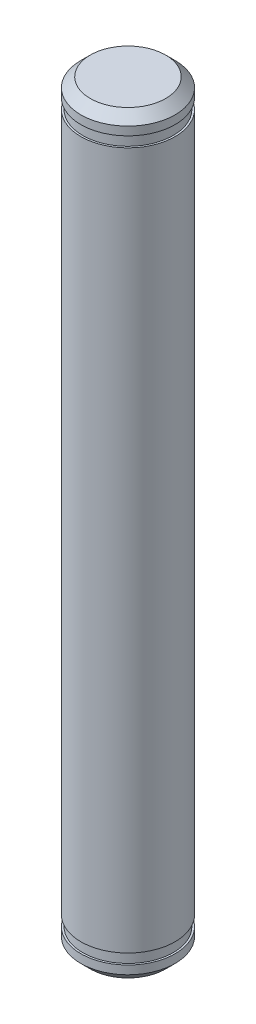
ISO-10303-21;
HEADER;
FILE_DESCRIPTION(('STEP AP214'),'2;1');
FILE_NAME('part.step','',(''),(''),'','','');
FILE_SCHEMA(('AUTOMOTIVE_DESIGN { 1 0 10303 214 1 1 1 1 }'));
ENDSEC;
DATA;
#1=APPLICATION_CONTEXT('core data for automotive mechanical design processes');
#2=APPLICATION_PROTOCOL_DEFINITION('international standard','automotive_design',2000,#1);
#3=PRODUCT_CONTEXT('',#1,'mechanical');
#4=PRODUCT('Part','Part','',(#3));
#5=PRODUCT_RELATED_PRODUCT_CATEGORY('part','',(#4));
#6=PRODUCT_DEFINITION_FORMATION('','',#4);
#7=PRODUCT_DEFINITION_CONTEXT('part definition',#1,'design');
#8=PRODUCT_DEFINITION('design','',#6,#7);
#9=PRODUCT_DEFINITION_SHAPE('','',#8);
#10=(LENGTH_UNIT() NAMED_UNIT(*) SI_UNIT(.MILLI.,.METRE.));
#11=(NAMED_UNIT(*) PLANE_ANGLE_UNIT() SI_UNIT($,.RADIAN.));
#12=(NAMED_UNIT(*) SI_UNIT($,.STERADIAN.) SOLID_ANGLE_UNIT());
#13=UNCERTAINTY_MEASURE_WITH_UNIT(LENGTH_MEASURE(1.E-05),#10,'distance_accuracy_value','');
#14=(GEOMETRIC_REPRESENTATION_CONTEXT(3) GLOBAL_UNCERTAINTY_ASSIGNED_CONTEXT((#13)) GLOBAL_UNIT_ASSIGNED_CONTEXT((#10,
#11,#12)) REPRESENTATION_CONTEXT('',''));
#15=CARTESIAN_POINT('',(0.,0.,0.));
#16=DIRECTION('',(0.,0.,1.));
#17=DIRECTION('',(1.,0.,0.));
#18=AXIS2_PLACEMENT_3D('',#15,#16,#17);
#19=CARTESIAN_POINT('',(0.,40.,0.));
#20=DIRECTION('',(0.,1.,0.));
#21=DIRECTION('',(-1.,0.,0.));
#22=AXIS2_PLACEMENT_3D('',#19,#20,#21);
#23=CYLINDRICAL_SURFACE('',#22,5.);
#24=CARTESIAN_POINT('',(0.,37.,0.));
#25=DIRECTION('',(0.,1.,0.));
#26=DIRECTION('',(-1.,0.,0.));
#27=AXIS2_PLACEMENT_3D('',#24,#25,#26);
#28=CIRCLE('',#27,5.);
#29=CARTESIAN_POINT('',(-5.00000000000002,37.,0.));
#30=VERTEX_POINT('',#29);
#31=EDGE_CURVE('E57',#30,#30,#28,.T.);
#32=ORIENTED_EDGE('',*,*,#31,.F.);
#33=EDGE_LOOP('',(#32));
#34=FACE_BOUND('',#33,.T.);
#35=CARTESIAN_POINT('',(0.,-37.,0.));
#36=DIRECTION('',(0.,1.,0.));
#37=DIRECTION('',(-1.,0.,0.));
#38=AXIS2_PLACEMENT_3D('',#35,#36,#37);
#39=CIRCLE('',#38,5.);
#40=CARTESIAN_POINT('',(-5.,-37.,0.));
#41=VERTEX_POINT('',#40);
#42=EDGE_CURVE('E69',#41,#41,#39,.T.);
#43=ORIENTED_EDGE('',*,*,#42,.T.);
#44=EDGE_LOOP('',(#43));
#45=FACE_BOUND('',#44,.T.);
#46=ADVANCED_FACE('F35',(#34,#45),#23,.T.);
#47=CARTESIAN_POINT('',(0.,40.,0.));
#48=DIRECTION('',(0.,-1.,0.));
#49=DIRECTION('',(1.,0.,0.));
#50=AXIS2_PLACEMENT_3D('',#47,#48,#49);
#51=PLANE('',#50);
#52=CARTESIAN_POINT('',(0.,40.,0.));
#53=DIRECTION('',(0.,-1.,0.));
#54=DIRECTION('',(1.,0.,0.));
#55=AXIS2_PLACEMENT_3D('',#52,#53,#54);
#56=CIRCLE('',#55,4.00000000000002);
#57=CARTESIAN_POINT('',(4.,40.,0.));
#58=VERTEX_POINT('',#57);
#59=EDGE_CURVE('E10',#58,#58,#56,.F.);
#60=ORIENTED_EDGE('',*,*,#59,.T.);
#61=EDGE_LOOP('',(#60));
#62=FACE_BOUND('',#61,.T.);
#63=ADVANCED_FACE('F110',(#62),#51,.F.);
#64=CARTESIAN_POINT('',(0.,38.1,0.));
#65=DIRECTION('',(0.,1.,0.));
#66=DIRECTION('',(-1.,0.,0.));
#67=AXIS2_PLACEMENT_3D('',#64,#65,#66);
#68=CIRCLE('',#67,5.);
#69=CARTESIAN_POINT('',(-5.00000000000002,38.1,0.));
#70=VERTEX_POINT('',#69);
#71=EDGE_CURVE('E56',#70,#70,#68,.T.);
#72=ORIENTED_EDGE('',*,*,#71,.T.);
#73=EDGE_LOOP('',(#72));
#74=FACE_BOUND('',#73,.T.);
#75=CARTESIAN_POINT('',(0.,39.,0.));
#76=DIRECTION('',(0.,-1.,0.));
#77=DIRECTION('',(1.,0.,0.));
#78=AXIS2_PLACEMENT_3D('',#75,#76,#77);
#79=CIRCLE('',#78,5.);
#80=CARTESIAN_POINT('',(4.99999999999999,39.,0.));
#81=VERTEX_POINT('',#80);
#82=EDGE_CURVE('E51',#81,#81,#79,.T.);
#83=ORIENTED_EDGE('',*,*,#82,.T.);
#84=EDGE_LOOP('',(#83));
#85=FACE_BOUND('',#84,.T.);
#86=ADVANCED_FACE('F97',(#74,#85),#23,.T.);
#87=CARTESIAN_POINT('',(0.,40.,0.));
#88=DIRECTION('',(0.,-1.,0.));
#89=DIRECTION('',(1.,0.,0.));
#90=AXIS2_PLACEMENT_3D('',#87,#88,#89);
#91=CONICAL_SURFACE('',#90,4.00000000000002,0.785398163397446);
#92=ORIENTED_EDGE('',*,*,#82,.F.);
#93=EDGE_LOOP('',(#92));
#94=FACE_BOUND('',#93,.T.);
#95=ORIENTED_EDGE('',*,*,#59,.F.);
#96=EDGE_LOOP('',(#95));
#97=FACE_BOUND('',#96,.T.);
#98=ADVANCED_FACE('F38',(#94,#97),#91,.T.);
#99=CARTESIAN_POINT('',(0.,38.1,0.));
#100=DIRECTION('',(0.,1.,0.));
#101=DIRECTION('',(-1.,0.,0.));
#102=AXIS2_PLACEMENT_3D('',#99,#100,#101);
#103=PLANE('',#102);
#104=ORIENTED_EDGE('',*,*,#71,.F.);
#105=EDGE_LOOP('',(#104));
#106=FACE_BOUND('',#105,.T.);
#107=CARTESIAN_POINT('',(0.,38.1,0.));
#108=DIRECTION('',(0.,1.,0.));
#109=DIRECTION('',(-1.,0.,0.));
#110=AXIS2_PLACEMENT_3D('',#107,#108,#109);
#111=CIRCLE('',#110,4.8);
#112=CARTESIAN_POINT('',(-4.80000000000001,38.1,0.));
#113=VERTEX_POINT('',#112);
#114=EDGE_CURVE('E60',#113,#113,#111,.T.);
#115=ORIENTED_EDGE('',*,*,#114,.T.);
#116=EDGE_LOOP('',(#115));
#117=FACE_BOUND('',#116,.T.);
#118=ADVANCED_FACE('F122',(#106,#117),#103,.F.);
#119=CARTESIAN_POINT('',(0.,37.,0.));
#120=DIRECTION('',(0.,1.,0.));
#121=DIRECTION('',(-1.,0.,0.));
#122=AXIS2_PLACEMENT_3D('',#119,#120,#121);
#123=PLANE('',#122);
#124=ORIENTED_EDGE('',*,*,#31,.T.);
#125=EDGE_LOOP('',(#124));
#126=FACE_BOUND('',#125,.T.);
#127=CARTESIAN_POINT('',(0.,37.,0.));
#128=DIRECTION('',(0.,1.,0.));
#129=DIRECTION('',(-1.,0.,0.));
#130=AXIS2_PLACEMENT_3D('',#127,#128,#129);
#131=CIRCLE('',#130,4.8);
#132=CARTESIAN_POINT('',(-4.80000000000001,37.,0.));
#133=VERTEX_POINT('',#132);
#134=EDGE_CURVE('E63',#133,#133,#131,.T.);
#135=ORIENTED_EDGE('',*,*,#134,.F.);
#136=EDGE_LOOP('',(#135));
#137=FACE_BOUND('',#136,.T.);
#138=ADVANCED_FACE('F131',(#126,#137),#123,.T.);
#139=CARTESIAN_POINT('',(0.,38.1,0.));
#140=DIRECTION('',(0.,-1.,0.));
#141=DIRECTION('',(1.,0.,0.));
#142=AXIS2_PLACEMENT_3D('',#139,#140,#141);
#143=CYLINDRICAL_SURFACE('',#142,4.8);
#144=ORIENTED_EDGE('',*,*,#114,.F.);
#145=EDGE_LOOP('',(#144));
#146=FACE_BOUND('',#145,.T.);
#147=ORIENTED_EDGE('',*,*,#134,.T.);
#148=EDGE_LOOP('',(#147));
#149=FACE_BOUND('',#148,.T.);
#150=ADVANCED_FACE('F88',(#146,#149),#143,.T.);
#151=CARTESIAN_POINT('',(0.,-38.1,0.));
#152=DIRECTION('',(0.,-1.,0.));
#153=DIRECTION('',(-1.,0.,0.));
#154=AXIS2_PLACEMENT_3D('',#151,#152,#153);
#155=PLANE('',#154);
#156=CARTESIAN_POINT('',(0.,-38.1,0.));
#157=DIRECTION('',(0.,1.,0.));
#158=DIRECTION('',(-1.,0.,0.));
#159=AXIS2_PLACEMENT_3D('',#156,#157,#158);
#160=CIRCLE('',#159,4.8);
#161=CARTESIAN_POINT('',(-4.79999999999999,-38.1,0.));
#162=VERTEX_POINT('',#161);
#163=EDGE_CURVE('E72',#162,#162,#160,.T.);
#164=ORIENTED_EDGE('',*,*,#163,.F.);
#165=EDGE_LOOP('',(#164));
#166=FACE_BOUND('',#165,.T.);
#167=CARTESIAN_POINT('',(0.,-38.1,0.));
#168=DIRECTION('',(0.,1.,0.));
#169=DIRECTION('',(-1.,0.,0.));
#170=AXIS2_PLACEMENT_3D('',#167,#168,#169);
#171=CIRCLE('',#170,5.);
#172=CARTESIAN_POINT('',(-5.,-38.1,0.));
#173=VERTEX_POINT('',#172);
#174=EDGE_CURVE('E66',#173,#173,#171,.T.);
#175=ORIENTED_EDGE('',*,*,#174,.T.);
#176=EDGE_LOOP('',(#175));
#177=FACE_BOUND('',#176,.T.);
#178=ADVANCED_FACE('F84',(#166,#177),#155,.F.);
#179=CARTESIAN_POINT('',(0.,-37.,0.));
#180=DIRECTION('',(0.,-1.,0.));
#181=DIRECTION('',(-1.,0.,0.));
#182=AXIS2_PLACEMENT_3D('',#179,#180,#181);
#183=PLANE('',#182);
#184=CARTESIAN_POINT('',(0.,-37.,0.));
#185=DIRECTION('',(0.,1.,0.));
#186=DIRECTION('',(-1.,0.,0.));
#187=AXIS2_PLACEMENT_3D('',#184,#185,#186);
#188=CIRCLE('',#187,4.8);
#189=CARTESIAN_POINT('',(-4.79999999999999,-37.,0.));
#190=VERTEX_POINT('',#189);
#191=EDGE_CURVE('E75',#190,#190,#188,.T.);
#192=ORIENTED_EDGE('',*,*,#191,.T.);
#193=EDGE_LOOP('',(#192));
#194=FACE_BOUND('',#193,.T.);
#195=ORIENTED_EDGE('',*,*,#42,.F.);
#196=EDGE_LOOP('',(#195));
#197=FACE_BOUND('',#196,.T.);
#198=ADVANCED_FACE('F87',(#194,#197),#183,.T.);
#199=CARTESIAN_POINT('',(0.,-38.1,0.));
#200=DIRECTION('',(0.,1.,0.));
#201=DIRECTION('',(-1.,0.,0.));
#202=AXIS2_PLACEMENT_3D('',#199,#200,#201);
#203=CYLINDRICAL_SURFACE('',#202,4.8);
#204=ORIENTED_EDGE('',*,*,#163,.T.);
#205=EDGE_LOOP('',(#204));
#206=FACE_BOUND('',#205,.T.);
#207=ORIENTED_EDGE('',*,*,#191,.F.);
#208=EDGE_LOOP('',(#207));
#209=FACE_BOUND('',#208,.T.);
#210=ADVANCED_FACE('F81',(#206,#209),#203,.T.);
#211=CARTESIAN_POINT('',(5.00000000000001,-40.,0.));
#212=DIRECTION('',(0.,1.,0.));
#213=DIRECTION('',(-1.,0.,0.));
#214=AXIS2_PLACEMENT_3D('',#211,#212,#213);
#215=PLANE('',#214);
#216=CARTESIAN_POINT('',(0.,-40.,0.));
#217=DIRECTION('',(0.,1.,0.));
#218=DIRECTION('',(-1.,0.,0.));
#219=AXIS2_PLACEMENT_3D('',#216,#217,#218);
#220=CIRCLE('',#219,3.99999999999998);
#221=CARTESIAN_POINT('',(-3.99999999999997,-40.,0.));
#222=VERTEX_POINT('',#221);
#223=EDGE_CURVE('E43',#222,#222,#220,.F.);
#224=ORIENTED_EDGE('',*,*,#223,.T.);
#225=EDGE_LOOP('',(#224));
#226=FACE_BOUND('',#225,.T.);
#227=ADVANCED_FACE('F101',(#226),#215,.F.);
#228=CARTESIAN_POINT('',(0.,-39.,0.));
#229=DIRECTION('',(0.,1.,0.));
#230=DIRECTION('',(-1.,0.,0.));
#231=AXIS2_PLACEMENT_3D('',#228,#229,#230);
#232=CONICAL_SURFACE('',#231,5.,0.785398163397453);
#233=ORIENTED_EDGE('',*,*,#223,.F.);
#234=EDGE_LOOP('',(#233));
#235=FACE_BOUND('',#234,.T.);
#236=CARTESIAN_POINT('',(0.,-39.,0.));
#237=DIRECTION('',(0.,1.,0.));
#238=DIRECTION('',(-1.,0.,0.));
#239=AXIS2_PLACEMENT_3D('',#236,#237,#238);
#240=CIRCLE('',#239,5.);
#241=CARTESIAN_POINT('',(-5.,-39.,0.));
#242=VERTEX_POINT('',#241);
#243=EDGE_CURVE('E47',#242,#242,#240,.T.);
#244=ORIENTED_EDGE('',*,*,#243,.F.);
#245=EDGE_LOOP('',(#244));
#246=FACE_BOUND('',#245,.T.);
#247=ADVANCED_FACE('F95',(#235,#246),#232,.T.);
#248=ORIENTED_EDGE('',*,*,#174,.F.);
#249=EDGE_LOOP('',(#248));
#250=FACE_BOUND('',#249,.T.);
#251=ORIENTED_EDGE('',*,*,#243,.T.);
#252=EDGE_LOOP('',(#251));
#253=FACE_BOUND('',#252,.T.);
#254=ADVANCED_FACE('F92',(#250,#253),#23,.T.);
#255=CLOSED_SHELL('',(#46,#63,#86,#98,#118,#138,#150,#178,#198,#210,#227,#247,#254));
#256=MANIFOLD_SOLID_BREP('B2',#255);
#257=ADVANCED_BREP_SHAPE_REPRESENTATION('',(#18,#256),#14);
#258=SHAPE_DEFINITION_REPRESENTATION(#9,#257);
ENDSEC;
END-ISO-10303-21;
